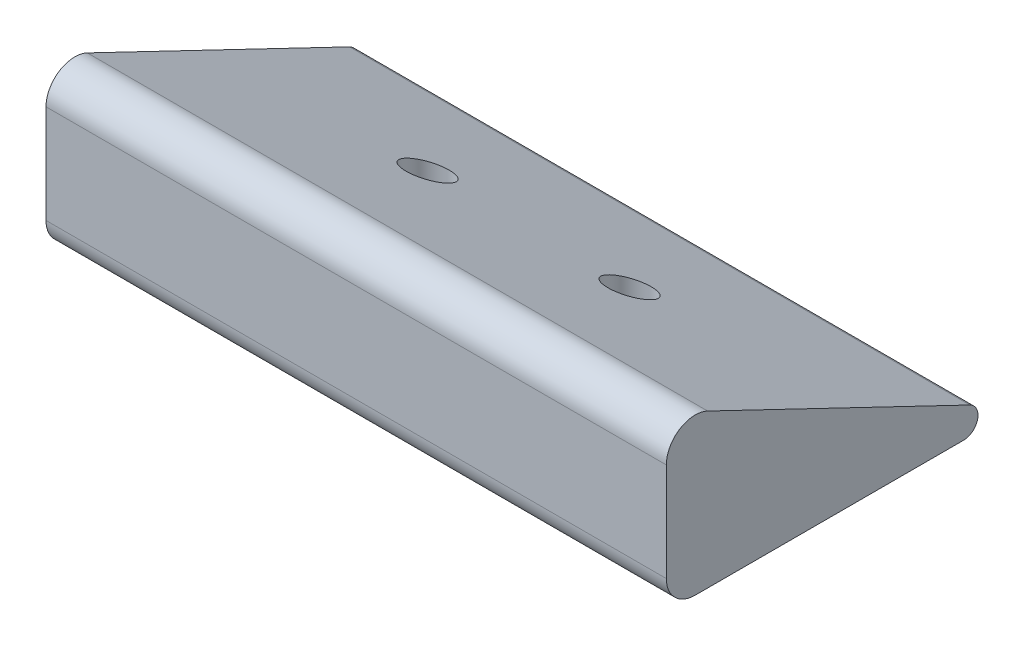
ISO-10303-21;
HEADER;
FILE_DESCRIPTION(('STEP AP214'),'2;1');
FILE_NAME('part.step','',(''),(''),'','','');
FILE_SCHEMA(('AUTOMOTIVE_DESIGN { 1 0 10303 214 1 1 1 1 }'));
ENDSEC;
DATA;
#1=APPLICATION_CONTEXT('core data for automotive mechanical design processes');
#2=APPLICATION_PROTOCOL_DEFINITION('international standard','automotive_design',2000,#1);
#3=PRODUCT_CONTEXT('',#1,'mechanical');
#4=PRODUCT('Part','Part','',(#3));
#5=PRODUCT_RELATED_PRODUCT_CATEGORY('part','',(#4));
#6=PRODUCT_DEFINITION_FORMATION('','',#4);
#7=PRODUCT_DEFINITION_CONTEXT('part definition',#1,'design');
#8=PRODUCT_DEFINITION('design','',#6,#7);
#9=PRODUCT_DEFINITION_SHAPE('','',#8);
#10=(LENGTH_UNIT() NAMED_UNIT(*) SI_UNIT(.MILLI.,.METRE.));
#11=(NAMED_UNIT(*) PLANE_ANGLE_UNIT() SI_UNIT($,.RADIAN.));
#12=(NAMED_UNIT(*) SI_UNIT($,.STERADIAN.) SOLID_ANGLE_UNIT());
#13=UNCERTAINTY_MEASURE_WITH_UNIT(LENGTH_MEASURE(1.E-05),#10,'distance_accuracy_value','');
#14=(GEOMETRIC_REPRESENTATION_CONTEXT(3) GLOBAL_UNCERTAINTY_ASSIGNED_CONTEXT((#13)) GLOBAL_UNIT_ASSIGNED_CONTEXT((#10,
#11,#12)) REPRESENTATION_CONTEXT('',''));
#15=CARTESIAN_POINT('',(0.,0.,0.));
#16=DIRECTION('',(0.,0.,1.));
#17=DIRECTION('',(1.,0.,0.));
#18=AXIS2_PLACEMENT_3D('',#15,#16,#17);
#19=CARTESIAN_POINT('',(43.,8.82153206018207,-2.));
#20=DIRECTION('',(-1.,0.,0.));
#21=DIRECTION('',(0.,0.,1.));
#22=AXIS2_PLACEMENT_3D('',#19,#20,#21);
#23=CYLINDRICAL_SURFACE('',#22,2.);
#24=CARTESIAN_POINT('',(0.,8.82153206018207,-2.));
#25=DIRECTION('',(1.,0.,0.));
#26=DIRECTION('',(0.,0.,-1.));
#27=AXIS2_PLACEMENT_3D('',#24,#25,#26);
#28=CIRCLE('',#27,2.);
#29=CARTESIAN_POINT('',(0.,10.6245781751186,-2.86546213516957));
#30=VERTEX_POINT('',#29);
#31=CARTESIAN_POINT('',(0.,8.82153206018205,0.));
#32=VERTEX_POINT('',#31);
#33=EDGE_CURVE('E129',#30,#32,#28,.T.);
#34=ORIENTED_EDGE('',*,*,#33,.T.);
#35=DIRECTION('',(-1.,0.,0.));
#36=VECTOR('',#35,1.);
#37=CARTESIAN_POINT('',(43.,8.82153206018205,0.));
#38=LINE('',#37,#36);
#39=CARTESIAN_POINT('',(43.,8.82153206018205,0.));
#40=VERTEX_POINT('',#39);
#41=EDGE_CURVE('E11',#40,#32,#38,.T.);
#42=ORIENTED_EDGE('',*,*,#41,.F.);
#43=CARTESIAN_POINT('',(43.,8.82153206018207,-2.));
#44=DIRECTION('',(1.,0.,0.));
#45=DIRECTION('',(0.,0.,-1.));
#46=AXIS2_PLACEMENT_3D('',#43,#44,#45);
#47=CIRCLE('',#46,2.);
#48=CARTESIAN_POINT('',(43.,10.6245781751186,-2.86546213516957));
#49=VERTEX_POINT('',#48);
#50=EDGE_CURVE('E139',#49,#40,#47,.T.);
#51=ORIENTED_EDGE('',*,*,#50,.F.);
#52=DIRECTION('',(-1.,0.,0.));
#53=VECTOR('',#52,1.);
#54=CARTESIAN_POINT('',(43.,10.6245781751186,-2.86546213516957));
#55=LINE('',#54,#53);
#56=EDGE_CURVE('E125',#49,#30,#55,.T.);
#57=ORIENTED_EDGE('',*,*,#56,.T.);
#58=EDGE_LOOP('',(#34,#42,#51,#57));
#59=FACE_BOUND('',#58,.T.);
#60=ADVANCED_FACE('F43',(#59),#23,.T.);
#61=CARTESIAN_POINT('',(43.,8.82153206018205,0.));
#62=DIRECTION('',(0.,0.,-1.));
#63=DIRECTION('',(0.,1.,0.));
#64=AXIS2_PLACEMENT_3D('',#61,#62,#63);
#65=PLANE('',#64);
#66=DIRECTION('',(0.,-1.,0.));
#67=VECTOR('',#66,1.);
#68=CARTESIAN_POINT('',(0.,8.82153206018205,0.));
#69=LINE('',#68,#67);
#70=CARTESIAN_POINT('',(0.,2.,0.));
#71=VERTEX_POINT('',#70);
#72=EDGE_CURVE('E132',#32,#71,#69,.T.);
#73=ORIENTED_EDGE('',*,*,#72,.T.);
#74=DIRECTION('',(-1.,0.,0.));
#75=VECTOR('',#74,1.);
#76=CARTESIAN_POINT('',(43.,2.,0.));
#77=LINE('',#76,#75);
#78=CARTESIAN_POINT('',(43.,2.,0.));
#79=VERTEX_POINT('',#78);
#80=EDGE_CURVE('E52',#79,#71,#77,.T.);
#81=ORIENTED_EDGE('',*,*,#80,.F.);
#82=DIRECTION('',(0.,-1.,0.));
#83=VECTOR('',#82,1.);
#84=CARTESIAN_POINT('',(43.,8.82153206018205,0.));
#85=LINE('',#84,#83);
#86=EDGE_CURVE('E98',#40,#79,#85,.T.);
#87=ORIENTED_EDGE('',*,*,#86,.F.);
#88=ORIENTED_EDGE('',*,*,#41,.T.);
#89=EDGE_LOOP('',(#73,#81,#87,#88));
#90=FACE_BOUND('',#89,.T.);
#91=ADVANCED_FACE('F161',(#90),#65,.F.);
#92=CARTESIAN_POINT('',(43.,2.,-2.));
#93=DIRECTION('',(-1.,0.,0.));
#94=DIRECTION('',(0.,0.,1.));
#95=AXIS2_PLACEMENT_3D('',#92,#93,#94);
#96=CYLINDRICAL_SURFACE('',#95,2.);
#97=CARTESIAN_POINT('',(0.,2.,-2.));
#98=DIRECTION('',(1.,0.,0.));
#99=DIRECTION('',(0.,0.,1.));
#100=AXIS2_PLACEMENT_3D('',#97,#98,#99);
#101=CIRCLE('',#100,2.);
#102=CARTESIAN_POINT('',(0.,0.,-2.00000000000001));
#103=VERTEX_POINT('',#102);
#104=EDGE_CURVE('E134',#71,#103,#101,.T.);
#105=ORIENTED_EDGE('',*,*,#104,.T.);
#106=DIRECTION('',(-1.,0.,0.));
#107=VECTOR('',#106,1.);
#108=CARTESIAN_POINT('',(43.,0.,-2.00000000000001));
#109=LINE('',#108,#107);
#110=CARTESIAN_POINT('',(43.,0.,-2.00000000000001));
#111=VERTEX_POINT('',#110);
#112=EDGE_CURVE('E120',#111,#103,#109,.T.);
#113=ORIENTED_EDGE('',*,*,#112,.F.);
#114=CARTESIAN_POINT('',(43.,2.,-2.));
#115=DIRECTION('',(1.,0.,0.));
#116=DIRECTION('',(0.,0.,1.));
#117=AXIS2_PLACEMENT_3D('',#114,#115,#116);
#118=CIRCLE('',#117,2.);
#119=EDGE_CURVE('E111',#79,#111,#118,.T.);
#120=ORIENTED_EDGE('',*,*,#119,.F.);
#121=ORIENTED_EDGE('',*,*,#80,.T.);
#122=EDGE_LOOP('',(#105,#113,#120,#121));
#123=FACE_BOUND('',#122,.T.);
#124=ADVANCED_FACE('F164',(#123),#96,.T.);
#125=CARTESIAN_POINT('',(43.,0.,-2.00000000000001));
#126=DIRECTION('',(0.,1.,0.));
#127=DIRECTION('',(0.,0.,1.));
#128=AXIS2_PLACEMENT_3D('',#125,#126,#127);
#129=PLANE('',#128);
#130=CARTESIAN_POINT('',(14.5,0.,-11.951977882722));
#131=DIRECTION('',(0.,1.,0.));
#132=DIRECTION('',(0.,0.,1.));
#133=AXIS2_PLACEMENT_3D('',#130,#131,#132);
#134=CIRCLE('',#133,1.5);
#135=CARTESIAN_POINT('',(14.5,0.,-10.451977882722));
#136=VERTEX_POINT('',#135);
#137=EDGE_CURVE('E146',#136,#136,#134,.T.);
#138=ORIENTED_EDGE('',*,*,#137,.T.);
#139=EDGE_LOOP('',(#138));
#140=FACE_BOUND('',#139,.T.);
#141=CARTESIAN_POINT('',(28.5,0.,-11.951977882722));
#142=DIRECTION('',(0.,1.,0.));
#143=DIRECTION('',(0.,0.,-1.));
#144=AXIS2_PLACEMENT_3D('',#141,#142,#143);
#145=CIRCLE('',#144,1.5);
#146=CARTESIAN_POINT('',(28.5,0.,-13.451977882722));
#147=VERTEX_POINT('',#146);
#148=EDGE_CURVE('E151',#147,#147,#145,.T.);
#149=ORIENTED_EDGE('',*,*,#148,.T.);
#150=EDGE_LOOP('',(#149));
#151=FACE_BOUND('',#150,.T.);
#152=DIRECTION('',(0.,0.,-1.));
#153=VECTOR('',#152,1.);
#154=CARTESIAN_POINT('',(0.,0.,-2.00000000000001));
#155=LINE('',#154,#153);
#156=CARTESIAN_POINT('',(0.,0.,-20.6057625626896));
#157=VERTEX_POINT('',#156);
#158=EDGE_CURVE('E119',#103,#157,#155,.T.);
#159=ORIENTED_EDGE('',*,*,#158,.T.);
#160=DIRECTION('',(-1.,0.,0.));
#161=VECTOR('',#160,1.);
#162=CARTESIAN_POINT('',(43.,0.,-20.6057625626896));
#163=LINE('',#162,#161);
#164=CARTESIAN_POINT('',(43.,0.,-20.6057625626896));
#165=VERTEX_POINT('',#164);
#166=EDGE_CURVE('E116',#165,#157,#163,.T.);
#167=ORIENTED_EDGE('',*,*,#166,.F.);
#168=DIRECTION('',(0.,0.,-1.));
#169=VECTOR('',#168,1.);
#170=CARTESIAN_POINT('',(43.,0.,-2.00000000000001));
#171=LINE('',#170,#169);
#172=EDGE_CURVE('E105',#111,#165,#171,.T.);
#173=ORIENTED_EDGE('',*,*,#172,.F.);
#174=ORIENTED_EDGE('',*,*,#112,.T.);
#175=EDGE_LOOP('',(#159,#167,#173,#174));
#176=FACE_BOUND('',#175,.T.);
#177=ADVANCED_FACE('F117',(#140,#151,#176),#129,.F.);
#178=CARTESIAN_POINT('',(43.,1.,-20.6057625626897));
#179=DIRECTION('',(-1.,0.,0.));
#180=DIRECTION('',(0.,0.,1.));
#181=AXIS2_PLACEMENT_3D('',#178,#179,#180);
#182=CYLINDRICAL_SURFACE('',#181,1.);
#183=CARTESIAN_POINT('',(0.,1.,-20.6057625626897));
#184=DIRECTION('',(1.,0.,0.));
#185=DIRECTION('',(0.,0.,1.));
#186=AXIS2_PLACEMENT_3D('',#183,#184,#185);
#187=CIRCLE('',#186,1.);
#188=CARTESIAN_POINT('',(0.,1.9015230574683,-21.0384936302744));
#189=VERTEX_POINT('',#188);
#190=EDGE_CURVE('E84',#157,#189,#187,.T.);
#191=ORIENTED_EDGE('',*,*,#190,.T.);
#192=DIRECTION('',(-1.,0.,0.));
#193=VECTOR('',#192,1.);
#194=CARTESIAN_POINT('',(43.,1.9015230574683,-21.0384936302744));
#195=LINE('',#194,#193);
#196=CARTESIAN_POINT('',(43.,1.9015230574683,-21.0384936302744));
#197=VERTEX_POINT('',#196);
#198=EDGE_CURVE('E121',#197,#189,#195,.T.);
#199=ORIENTED_EDGE('',*,*,#198,.F.);
#200=CARTESIAN_POINT('',(43.,1.,-20.6057625626897));
#201=DIRECTION('',(1.,0.,0.));
#202=DIRECTION('',(0.,0.,1.));
#203=AXIS2_PLACEMENT_3D('',#200,#201,#202);
#204=CIRCLE('',#203,1.);
#205=EDGE_CURVE('E109',#165,#197,#204,.T.);
#206=ORIENTED_EDGE('',*,*,#205,.F.);
#207=ORIENTED_EDGE('',*,*,#166,.T.);
#208=EDGE_LOOP('',(#191,#199,#206,#207));
#209=FACE_BOUND('',#208,.T.);
#210=ADVANCED_FACE('F123',(#209),#182,.T.);
#211=CARTESIAN_POINT('',(43.,1.9015230574683,-21.0384936302744));
#212=DIRECTION('',(0.,-0.901523057468274,0.432731067584771));
#213=DIRECTION('',(0.,-0.432731067584771,-0.901523057468274));
#214=AXIS2_PLACEMENT_3D('',#211,#212,#213);
#215=PLANE('',#214);
#216=CARTESIAN_POINT('',(14.5,6.26305061629346,-11.951977882722));
#217=DIRECTION('',(0.,-0.901523057468274,0.432731067584771));
#218=DIRECTION('',(0.,0.432731067584771,0.901523057468274));
#219=AXIS2_PLACEMENT_3D('',#216,#217,#218);
#220=ELLIPSE('',#219,1.66385095486345,1.5);
#221=CARTESIAN_POINT('',(14.5,6.98305061629346,-10.451977882722));
#222=VERTEX_POINT('',#221);
#223=EDGE_CURVE('E46',#222,#222,#220,.T.);
#224=ORIENTED_EDGE('',*,*,#223,.T.);
#225=EDGE_LOOP('',(#224));
#226=FACE_BOUND('',#225,.T.);
#227=CARTESIAN_POINT('',(28.5,6.26305061629346,-11.951977882722));
#228=DIRECTION('',(0.,-0.901523057468274,0.432731067584771));
#229=DIRECTION('',(0.,0.432731067584771,0.901523057468274));
#230=AXIS2_PLACEMENT_3D('',#227,#228,#229);
#231=ELLIPSE('',#230,1.66385095486345,1.5);
#232=CARTESIAN_POINT('',(28.5,6.98305061629346,-10.451977882722));
#233=VERTEX_POINT('',#232);
#234=EDGE_CURVE('E144',#233,#233,#231,.T.);
#235=ORIENTED_EDGE('',*,*,#234,.T.);
#236=EDGE_LOOP('',(#235));
#237=FACE_BOUND('',#236,.T.);
#238=DIRECTION('',(0.,0.432731067584771,0.901523057468274));
#239=VECTOR('',#238,1.);
#240=CARTESIAN_POINT('',(0.,1.9015230574683,-21.0384936302744));
#241=LINE('',#240,#239);
#242=EDGE_CURVE('E90',#189,#30,#241,.T.);
#243=ORIENTED_EDGE('',*,*,#242,.T.);
#244=ORIENTED_EDGE('',*,*,#56,.F.);
#245=DIRECTION('',(0.,0.432731067584771,0.901523057468274));
#246=VECTOR('',#245,1.);
#247=CARTESIAN_POINT('',(43.,1.9015230574683,-21.0384936302744));
#248=LINE('',#247,#246);
#249=EDGE_CURVE('E61',#197,#49,#248,.T.);
#250=ORIENTED_EDGE('',*,*,#249,.F.);
#251=ORIENTED_EDGE('',*,*,#198,.T.);
#252=EDGE_LOOP('',(#243,#244,#250,#251));
#253=FACE_BOUND('',#252,.T.);
#254=ADVANCED_FACE('F169',(#226,#237,#253),#215,.F.);
#255=CARTESIAN_POINT('',(43.,8.82153206018207,-2.));
#256=DIRECTION('',(1.,0.,0.));
#257=DIRECTION('',(0.,0.,-1.));
#258=AXIS2_PLACEMENT_3D('',#255,#256,#257);
#259=PLANE('',#258);
#260=ORIENTED_EDGE('',*,*,#50,.T.);
#261=ORIENTED_EDGE('',*,*,#86,.T.);
#262=ORIENTED_EDGE('',*,*,#119,.T.);
#263=ORIENTED_EDGE('',*,*,#172,.T.);
#264=ORIENTED_EDGE('',*,*,#205,.T.);
#265=ORIENTED_EDGE('',*,*,#249,.T.);
#266=EDGE_LOOP('',(#260,#261,#262,#263,#264,#265));
#267=FACE_BOUND('',#266,.T.);
#268=ADVANCED_FACE('F107',(#267),#259,.T.);
#269=CARTESIAN_POINT('',(0.,8.82153206018207,-2.));
#270=DIRECTION('',(1.,0.,0.));
#271=DIRECTION('',(0.,0.,-1.));
#272=AXIS2_PLACEMENT_3D('',#269,#270,#271);
#273=PLANE('',#272);
#274=ORIENTED_EDGE('',*,*,#33,.F.);
#275=ORIENTED_EDGE('',*,*,#242,.F.);
#276=ORIENTED_EDGE('',*,*,#190,.F.);
#277=ORIENTED_EDGE('',*,*,#158,.F.);
#278=ORIENTED_EDGE('',*,*,#104,.F.);
#279=ORIENTED_EDGE('',*,*,#72,.F.);
#280=EDGE_LOOP('',(#274,#275,#276,#277,#278,#279));
#281=FACE_BOUND('',#280,.T.);
#282=ADVANCED_FACE('F167',(#281),#273,.F.);
#283=CARTESIAN_POINT('',(28.5,0.,-11.951977882722));
#284=DIRECTION('',(0.,1.,0.));
#285=DIRECTION('',(0.,0.,1.));
#286=AXIS2_PLACEMENT_3D('',#283,#284,#285);
#287=CYLINDRICAL_SURFACE('',#286,1.5);
#288=ORIENTED_EDGE('',*,*,#148,.F.);
#289=EDGE_LOOP('',(#288));
#290=FACE_BOUND('',#289,.T.);
#291=ORIENTED_EDGE('',*,*,#234,.F.);
#292=EDGE_LOOP('',(#291));
#293=FACE_BOUND('',#292,.T.);
#294=ADVANCED_FACE('F197',(#290,#293),#287,.F.);
#295=CARTESIAN_POINT('',(14.5,0.,-11.951977882722));
#296=DIRECTION('',(0.,1.,0.));
#297=DIRECTION('',(0.,0.,1.));
#298=AXIS2_PLACEMENT_3D('',#295,#296,#297);
#299=CYLINDRICAL_SURFACE('',#298,1.5);
#300=ORIENTED_EDGE('',*,*,#137,.F.);
#301=EDGE_LOOP('',(#300));
#302=FACE_BOUND('',#301,.T.);
#303=ORIENTED_EDGE('',*,*,#223,.F.);
#304=EDGE_LOOP('',(#303));
#305=FACE_BOUND('',#304,.T.);
#306=ADVANCED_FACE('F199',(#302,#305),#299,.F.);
#307=CLOSED_SHELL('',(#60,#91,#124,#177,#210,#254,#268,#282,#294,#306));
#308=MANIFOLD_SOLID_BREP('B2',#307);
#309=ADVANCED_BREP_SHAPE_REPRESENTATION('',(#18,#308),#14);
#310=SHAPE_DEFINITION_REPRESENTATION(#9,#309);
ENDSEC;
END-ISO-10303-21;
